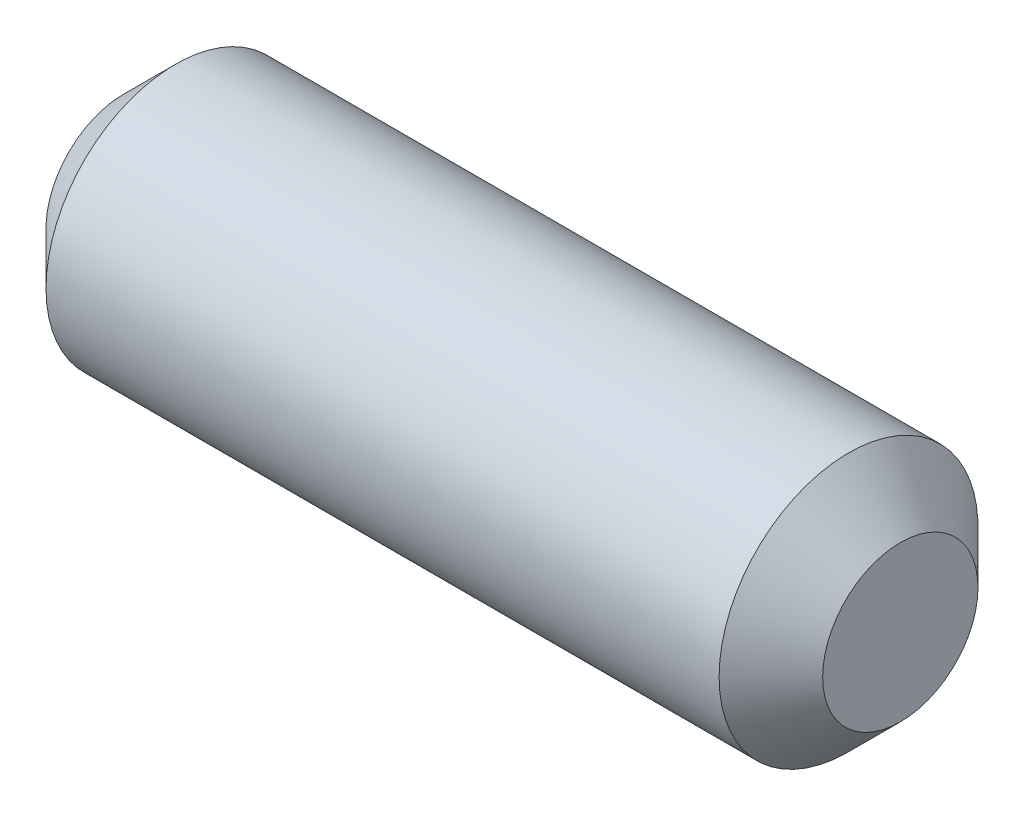
ISO-10303-21;
HEADER;
FILE_DESCRIPTION(('STEP AP214'),'2;1');
FILE_NAME('part.step','',(''),(''),'','','');
FILE_SCHEMA(('AUTOMOTIVE_DESIGN { 1 0 10303 214 1 1 1 1 }'));
ENDSEC;
DATA;
#1=APPLICATION_CONTEXT('core data for automotive mechanical design processes');
#2=APPLICATION_PROTOCOL_DEFINITION('international standard','automotive_design',2000,#1);
#3=PRODUCT_CONTEXT('',#1,'mechanical');
#4=PRODUCT('Part','Part','',(#3));
#5=PRODUCT_RELATED_PRODUCT_CATEGORY('part','',(#4));
#6=PRODUCT_DEFINITION_FORMATION('','',#4);
#7=PRODUCT_DEFINITION_CONTEXT('part definition',#1,'design');
#8=PRODUCT_DEFINITION('design','',#6,#7);
#9=PRODUCT_DEFINITION_SHAPE('','',#8);
#10=(LENGTH_UNIT() NAMED_UNIT(*) SI_UNIT(.MILLI.,.METRE.));
#11=(NAMED_UNIT(*) PLANE_ANGLE_UNIT() SI_UNIT($,.RADIAN.));
#12=(NAMED_UNIT(*) SI_UNIT($,.STERADIAN.) SOLID_ANGLE_UNIT());
#13=UNCERTAINTY_MEASURE_WITH_UNIT(LENGTH_MEASURE(1.E-05),#10,'distance_accuracy_value','');
#14=(GEOMETRIC_REPRESENTATION_CONTEXT(3) GLOBAL_UNCERTAINTY_ASSIGNED_CONTEXT((#13)) GLOBAL_UNIT_ASSIGNED_CONTEXT((#10,
#11,#12)) REPRESENTATION_CONTEXT('',''));
#15=CARTESIAN_POINT('',(0.,0.,0.));
#16=DIRECTION('',(0.,0.,1.));
#17=DIRECTION('',(1.,0.,0.));
#18=AXIS2_PLACEMENT_3D('',#15,#16,#17);
#19=CARTESIAN_POINT('',(19.05,0.,0.));
#20=DIRECTION('',(-1.,0.,0.));
#21=DIRECTION('',(0.,0.,1.));
#22=AXIS2_PLACEMENT_3D('',#19,#20,#21);
#23=CYLINDRICAL_SURFACE('',#22,3.175);
#24=CARTESIAN_POINT('',(1.27000000000002,0.,0.));
#25=DIRECTION('',(1.,0.,0.));
#26=DIRECTION('',(0.,0.,-1.));
#27=AXIS2_PLACEMENT_3D('',#24,#25,#26);
#28=CIRCLE('',#27,3.175);
#29=CARTESIAN_POINT('',(1.27000000000002,0.,3.175));
#30=VERTEX_POINT('',#29);
#31=EDGE_CURVE('E42',#30,#30,#28,.T.);
#32=CARTESIAN_POINT('',(17.78,0.,0.));
#33=DIRECTION('',(1.,0.,0.));
#34=DIRECTION('',(0.,0.,-1.));
#35=AXIS2_PLACEMENT_3D('',#32,#33,#34);
#36=CIRCLE('',#35,3.175);
#37=CARTESIAN_POINT('',(17.78,0.,3.175));
#38=VERTEX_POINT('',#37);
#39=EDGE_CURVE('E46',#38,#38,#36,.F.);
#40=CARTESIAN_POINT('',(1.27000000000002,0.,3.175));
#41=CARTESIAN_POINT('',(1.44197916666669,0.,3.175));
#42=CARTESIAN_POINT('',(1.61395833333335,0.,3.175));
#43=CARTESIAN_POINT('',(1.95791666666669,0.,3.175));
#44=CARTESIAN_POINT('',(2.12989583333335,0.,3.175));
#45=CARTESIAN_POINT('',(2.47385416666669,0.,3.175));
#46=CARTESIAN_POINT('',(2.64583333333335,0.,3.175));
#47=CARTESIAN_POINT('',(2.98979166666669,0.,3.175));
#48=CARTESIAN_POINT('',(3.16177083333335,0.,3.175));
#49=CARTESIAN_POINT('',(3.50572916666669,0.,3.175));
#50=CARTESIAN_POINT('',(3.67770833333335,0.,3.175));
#51=CARTESIAN_POINT('',(4.02166666666668,0.,3.175));
#52=CARTESIAN_POINT('',(4.19364583333335,0.,3.175));
#53=CARTESIAN_POINT('',(4.53760416666668,0.,3.175));
#54=CARTESIAN_POINT('',(4.70958333333335,0.,3.175));
#55=CARTESIAN_POINT('',(5.05354166666668,0.,3.175));
#56=CARTESIAN_POINT('',(5.22552083333335,0.,3.175));
#57=CARTESIAN_POINT('',(5.56947916666668,0.,3.175));
#58=CARTESIAN_POINT('',(5.74145833333335,0.,3.175));
#59=CARTESIAN_POINT('',(6.08541666666668,0.,3.175));
#60=CARTESIAN_POINT('',(6.25739583333335,0.,3.175));
#61=CARTESIAN_POINT('',(6.60135416666668,0.,3.175));
#62=CARTESIAN_POINT('',(6.77333333333335,0.,3.175));
#63=CARTESIAN_POINT('',(7.11729166666668,0.,3.175));
#64=CARTESIAN_POINT('',(7.28927083333335,0.,3.175));
#65=CARTESIAN_POINT('',(7.63322916666668,0.,3.175));
#66=CARTESIAN_POINT('',(7.80520833333335,0.,3.175));
#67=CARTESIAN_POINT('',(8.14916666666668,0.,3.175));
#68=CARTESIAN_POINT('',(8.32114583333335,0.,3.175));
#69=CARTESIAN_POINT('',(8.66510416666668,0.,3.175));
#70=CARTESIAN_POINT('',(8.83708333333335,0.,3.175));
#71=CARTESIAN_POINT('',(9.18104166666668,0.,3.175));
#72=CARTESIAN_POINT('',(9.35302083333335,0.,3.175));
#73=CARTESIAN_POINT('',(9.69697916666668,0.,3.175));
#74=CARTESIAN_POINT('',(9.86895833333335,0.,3.175));
#75=CARTESIAN_POINT('',(10.2129166666667,0.,3.175));
#76=CARTESIAN_POINT('',(10.3848958333333,0.,3.175));
#77=CARTESIAN_POINT('',(10.7288541666667,0.,3.175));
#78=CARTESIAN_POINT('',(10.9008333333333,0.,3.175));
#79=CARTESIAN_POINT('',(11.2447916666667,0.,3.175));
#80=CARTESIAN_POINT('',(11.4167708333333,0.,3.175));
#81=CARTESIAN_POINT('',(11.7607291666667,0.,3.175));
#82=CARTESIAN_POINT('',(11.9327083333333,0.,3.175));
#83=CARTESIAN_POINT('',(12.2766666666667,0.,3.175));
#84=CARTESIAN_POINT('',(12.4486458333333,0.,3.175));
#85=CARTESIAN_POINT('',(12.7926041666667,0.,3.175));
#86=CARTESIAN_POINT('',(12.9645833333333,0.,3.175));
#87=CARTESIAN_POINT('',(13.3085416666667,0.,3.175));
#88=CARTESIAN_POINT('',(13.4805208333333,0.,3.175));
#89=CARTESIAN_POINT('',(13.8244791666667,0.,3.175));
#90=CARTESIAN_POINT('',(13.9964583333333,0.,3.175));
#91=CARTESIAN_POINT('',(14.3404166666667,0.,3.175));
#92=CARTESIAN_POINT('',(14.5123958333333,0.,3.175));
#93=CARTESIAN_POINT('',(14.8563541666667,0.,3.175));
#94=CARTESIAN_POINT('',(15.0283333333333,0.,3.175));
#95=CARTESIAN_POINT('',(15.3722916666667,0.,3.175));
#96=CARTESIAN_POINT('',(15.5442708333333,0.,3.175));
#97=CARTESIAN_POINT('',(15.8882291666667,0.,3.175));
#98=CARTESIAN_POINT('',(16.0602083333333,0.,3.175));
#99=CARTESIAN_POINT('',(16.4041666666667,0.,3.175));
#100=CARTESIAN_POINT('',(16.5761458333333,0.,3.175));
#101=CARTESIAN_POINT('',(16.9201041666667,0.,3.175));
#102=CARTESIAN_POINT('',(17.0920833333333,0.,3.175));
#103=CARTESIAN_POINT('',(17.4360416666667,0.,3.175));
#104=CARTESIAN_POINT('',(17.6080208333333,0.,3.175));
#105=CARTESIAN_POINT('',(17.78,0.,3.175));
#106=B_SPLINE_CURVE_WITH_KNOTS('',3,(#40,#41,#42,#43,#44,#45,#46,#47,#48,#49,#50,#51,#52,#53,
#54,#55,#56,#57,#58,#59,#60,#61,#62,#63,#64,#65,#66,#67,#68,#69,#70,#71,#72,#73,#74,#75,#76,#77,
#78,#79,#80,#81,#82,#83,#84,#85,#86,#87,#88,#89,#90,#91,#92,#93,#94,#95,#96,#97,#98,#99,#100,
#101,#102,#103,#104,#105),.UNSPECIFIED.,.F.,.F.,(4,2,2,2,2,2,2,2,2,2,2,2,2,2,2,2,2,2,2,2,2,2,2,
2,2,2,2,2,2,2,2,2,4),(0.,0.515937500000001,1.031875,1.5478125,2.06375,2.5796875,3.095625,
3.6115625,4.1275,4.64343749999999,5.159375,5.67531249999999,6.19124999999999,6.70718749999999,
7.22312499999999,7.73906249999999,8.25499999999999,8.77093749999999,9.28687499999999,
9.80281249999999,10.31875,10.8346875,11.350625,11.8665625,12.3825,12.8984375,13.414375,
13.9303125,14.44625,14.9621875,15.478125,15.9940625,16.51),.UNSPECIFIED.);
#107=EDGE_CURVE('BSEAM31',#30,#38,#106,.T.);
#108=ORIENTED_EDGE('',*,*,#31,.T.);
#109=ORIENTED_EDGE('',*,*,#39,.T.);
#110=ORIENTED_EDGE('',*,*,#107,.T.);
#111=ORIENTED_EDGE('',*,*,#107,.F.);
#112=EDGE_LOOP('',(#108,#110,#109,#111));
#113=FACE_BOUND('',#112,.T.);
#114=ADVANCED_FACE('F31',(#113),#23,.T.);
#115=CARTESIAN_POINT('',(19.05,0.,0.));
#116=DIRECTION('',(1.,0.,0.));
#117=DIRECTION('',(0.,0.,-1.));
#118=AXIS2_PLACEMENT_3D('',#115,#116,#117);
#119=PLANE('',#118);
#120=CARTESIAN_POINT('',(19.05,0.,0.));
#121=DIRECTION('',(1.,0.,0.));
#122=DIRECTION('',(0.,0.,-1.));
#123=AXIS2_PLACEMENT_3D('',#120,#121,#122);
#124=CIRCLE('',#123,1.90500000000001);
#125=CARTESIAN_POINT('',(19.05,0.,-1.90500000000001));
#126=VERTEX_POINT('',#125);
#127=EDGE_CURVE('E10',#126,#126,#124,.T.);
#128=ORIENTED_EDGE('',*,*,#127,.T.);
#129=EDGE_LOOP('',(#128));
#130=FACE_BOUND('',#129,.T.);
#131=ADVANCED_FACE('F62',(#130),#119,.T.);
#132=CARTESIAN_POINT('',(0.,0.,0.));
#133=DIRECTION('',(1.,0.,0.));
#134=DIRECTION('',(0.,0.,-1.));
#135=AXIS2_PLACEMENT_3D('',#132,#133,#134);
#136=PLANE('',#135);
#137=CARTESIAN_POINT('',(0.,0.,0.));
#138=DIRECTION('',(1.,0.,0.));
#139=DIRECTION('',(0.,0.,-1.));
#140=AXIS2_PLACEMENT_3D('',#137,#138,#139);
#141=CIRCLE('',#140,1.90499999999997);
#142=CARTESIAN_POINT('',(0.,0.,-1.90499999999997));
#143=VERTEX_POINT('',#142);
#144=EDGE_CURVE('E38',#143,#143,#141,.F.);
#145=ORIENTED_EDGE('',*,*,#144,.T.);
#146=EDGE_LOOP('',(#145));
#147=FACE_BOUND('',#146,.T.);
#148=ADVANCED_FACE('F59',(#147),#136,.F.);
#149=CARTESIAN_POINT('',(1.27000000000002,0.,0.));
#150=DIRECTION('',(1.,0.,0.));
#151=DIRECTION('',(0.,0.,-1.));
#152=AXIS2_PLACEMENT_3D('',#149,#150,#151);
#153=CONICAL_SURFACE('',#152,3.175,0.78539816339745);
#154=ORIENTED_EDGE('',*,*,#144,.F.);
#155=EDGE_LOOP('',(#154));
#156=FACE_BOUND('',#155,.T.);
#157=ORIENTED_EDGE('',*,*,#31,.F.);
#158=EDGE_LOOP('',(#157));
#159=FACE_BOUND('',#158,.T.);
#160=ADVANCED_FACE('F55',(#156,#159),#153,.T.);
#161=CARTESIAN_POINT('',(19.05,0.,0.));
#162=DIRECTION('',(-1.,0.,0.));
#163=DIRECTION('',(0.,0.,1.));
#164=AXIS2_PLACEMENT_3D('',#161,#162,#163);
#165=CONICAL_SURFACE('',#164,1.90500000000001,0.785398163397447);
#166=ORIENTED_EDGE('',*,*,#39,.F.);
#167=EDGE_LOOP('',(#166));
#168=FACE_BOUND('',#167,.T.);
#169=ORIENTED_EDGE('',*,*,#127,.F.);
#170=EDGE_LOOP('',(#169));
#171=FACE_BOUND('',#170,.T.);
#172=ADVANCED_FACE('F33',(#168,#171),#165,.T.);
#173=CLOSED_SHELL('',(#114,#131,#148,#160,#172));
#174=MANIFOLD_SOLID_BREP('B2',#173);
#175=ADVANCED_BREP_SHAPE_REPRESENTATION('',(#18,#174),#14);
#176=SHAPE_DEFINITION_REPRESENTATION(#9,#175);
ENDSEC;
END-ISO-10303-21;
